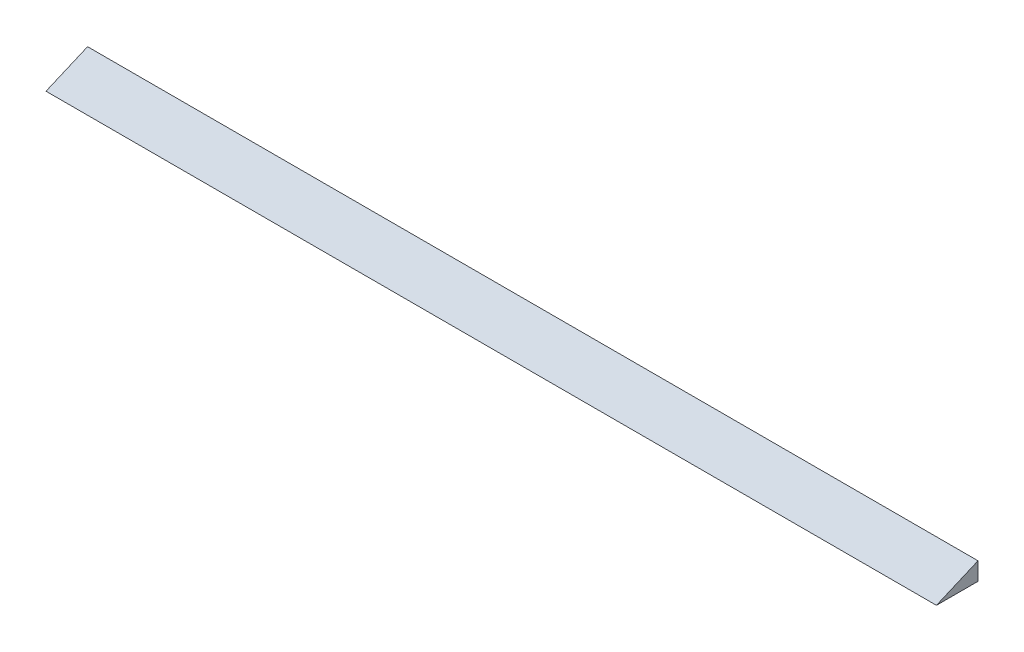
ISO-10303-21;
HEADER;
FILE_DESCRIPTION(('STEP AP214'),'2;1');
FILE_NAME('part.step','',(''),(''),'','','');
FILE_SCHEMA(('AUTOMOTIVE_DESIGN { 1 0 10303 214 1 1 1 1 }'));
ENDSEC;
DATA;
#1=APPLICATION_CONTEXT('core data for automotive mechanical design processes');
#2=APPLICATION_PROTOCOL_DEFINITION('international standard','automotive_design',2000,#1);
#3=PRODUCT_CONTEXT('',#1,'mechanical');
#4=PRODUCT('Part','Part','',(#3));
#5=PRODUCT_RELATED_PRODUCT_CATEGORY('part','',(#4));
#6=PRODUCT_DEFINITION_FORMATION('','',#4);
#7=PRODUCT_DEFINITION_CONTEXT('part definition',#1,'design');
#8=PRODUCT_DEFINITION('design','',#6,#7);
#9=PRODUCT_DEFINITION_SHAPE('','',#8);
#10=(LENGTH_UNIT() NAMED_UNIT(*) SI_UNIT(.MILLI.,.METRE.));
#11=(NAMED_UNIT(*) PLANE_ANGLE_UNIT() SI_UNIT($,.RADIAN.));
#12=(NAMED_UNIT(*) SI_UNIT($,.STERADIAN.) SOLID_ANGLE_UNIT());
#13=UNCERTAINTY_MEASURE_WITH_UNIT(LENGTH_MEASURE(1.E-05),#10,'distance_accuracy_value','');
#14=(GEOMETRIC_REPRESENTATION_CONTEXT(3) GLOBAL_UNCERTAINTY_ASSIGNED_CONTEXT((#13)) GLOBAL_UNIT_ASSIGNED_CONTEXT((#10,
#11,#12)) REPRESENTATION_CONTEXT('',''));
#15=CARTESIAN_POINT('',(0.,0.,0.));
#16=DIRECTION('',(0.,0.,1.));
#17=DIRECTION('',(1.,0.,0.));
#18=AXIS2_PLACEMENT_3D('',#15,#16,#17);
#19=CARTESIAN_POINT('',(75.,0.,7.));
#20=DIRECTION('',(0.,1.,0.));
#21=DIRECTION('',(0.,0.,1.));
#22=AXIS2_PLACEMENT_3D('',#19,#20,#21);
#23=PLANE('',#22);
#24=DIRECTION('',(0.,0.,-1.));
#25=VECTOR('',#24,1.);
#26=CARTESIAN_POINT('',(-75.,0.,7.));
#27=LINE('',#26,#25);
#28=CARTESIAN_POINT('',(-75.,0.,7.));
#29=VERTEX_POINT('',#28);
#30=CARTESIAN_POINT('',(-75.,0.,0.));
#31=VERTEX_POINT('',#30);
#32=EDGE_CURVE('E82',#29,#31,#27,.T.);
#33=ORIENTED_EDGE('',*,*,#32,.T.);
#34=DIRECTION('',(-1.,0.,0.));
#35=VECTOR('',#34,1.);
#36=CARTESIAN_POINT('',(75.,0.,0.));
#37=LINE('',#36,#35);
#38=CARTESIAN_POINT('',(75.,0.,0.));
#39=VERTEX_POINT('',#38);
#40=EDGE_CURVE('E11',#39,#31,#37,.T.);
#41=ORIENTED_EDGE('',*,*,#40,.F.);
#42=DIRECTION('',(0.,0.,-1.));
#43=VECTOR('',#42,1.);
#44=CARTESIAN_POINT('',(75.,0.,7.));
#45=LINE('',#44,#43);
#46=CARTESIAN_POINT('',(75.,0.,7.));
#47=VERTEX_POINT('',#46);
#48=EDGE_CURVE('E75',#47,#39,#45,.T.);
#49=ORIENTED_EDGE('',*,*,#48,.F.);
#50=DIRECTION('',(-1.,0.,0.));
#51=VECTOR('',#50,1.);
#52=CARTESIAN_POINT('',(75.,0.,7.));
#53=LINE('',#52,#51);
#54=EDGE_CURVE('E83',#47,#29,#53,.T.);
#55=ORIENTED_EDGE('',*,*,#54,.T.);
#56=EDGE_LOOP('',(#33,#41,#49,#55));
#57=FACE_BOUND('',#56,.T.);
#58=ADVANCED_FACE('F35',(#57),#23,.F.);
#59=CARTESIAN_POINT('',(75.,0.,0.));
#60=DIRECTION('',(0.,0.,1.));
#61=DIRECTION('',(1.,0.,0.));
#62=AXIS2_PLACEMENT_3D('',#59,#60,#61);
#63=PLANE('',#62);
#64=DIRECTION('',(0.,1.,0.));
#65=VECTOR('',#64,1.);
#66=CARTESIAN_POINT('',(-75.,0.,0.));
#67=LINE('',#66,#65);
#68=CARTESIAN_POINT('',(-75.,3.,0.));
#69=VERTEX_POINT('',#68);
#70=EDGE_CURVE('E63',#31,#69,#67,.T.);
#71=ORIENTED_EDGE('',*,*,#70,.T.);
#72=DIRECTION('',(-1.,0.,0.));
#73=VECTOR('',#72,1.);
#74=CARTESIAN_POINT('',(75.,3.,0.));
#75=LINE('',#74,#73);
#76=CARTESIAN_POINT('',(75.,3.,0.));
#77=VERTEX_POINT('',#76);
#78=EDGE_CURVE('E43',#77,#69,#75,.T.);
#79=ORIENTED_EDGE('',*,*,#78,.F.);
#80=DIRECTION('',(0.,1.,0.));
#81=VECTOR('',#80,1.);
#82=CARTESIAN_POINT('',(75.,0.,0.));
#83=LINE('',#82,#81);
#84=EDGE_CURVE('E71',#39,#77,#83,.T.);
#85=ORIENTED_EDGE('',*,*,#84,.F.);
#86=ORIENTED_EDGE('',*,*,#40,.T.);
#87=EDGE_LOOP('',(#71,#79,#85,#86));
#88=FACE_BOUND('',#87,.T.);
#89=ADVANCED_FACE('F72',(#88),#63,.F.);
#90=CARTESIAN_POINT('',(75.,3.,0.));
#91=DIRECTION('',(0.,-0.919145030018058,-0.393919298579168));
#92=DIRECTION('',(0.,0.393919298579168,-0.919145030018058));
#93=AXIS2_PLACEMENT_3D('',#90,#91,#92);
#94=PLANE('',#93);
#95=DIRECTION('',(0.,-0.393919298579168,0.919145030018058));
#96=VECTOR('',#95,1.);
#97=CARTESIAN_POINT('',(-75.,3.,0.));
#98=LINE('',#97,#96);
#99=EDGE_CURVE('E68',#69,#29,#98,.T.);
#100=ORIENTED_EDGE('',*,*,#99,.T.);
#101=ORIENTED_EDGE('',*,*,#54,.F.);
#102=DIRECTION('',(0.,-0.393919298579168,0.919145030018058));
#103=VECTOR('',#102,1.);
#104=CARTESIAN_POINT('',(75.,3.,0.));
#105=LINE('',#104,#103);
#106=EDGE_CURVE('E51',#77,#47,#105,.T.);
#107=ORIENTED_EDGE('',*,*,#106,.F.);
#108=ORIENTED_EDGE('',*,*,#78,.T.);
#109=EDGE_LOOP('',(#100,#101,#107,#108));
#110=FACE_BOUND('',#109,.T.);
#111=ADVANCED_FACE('F90',(#110),#94,.F.);
#112=CARTESIAN_POINT('',(75.,0.,0.));
#113=DIRECTION('',(1.,0.,0.));
#114=DIRECTION('',(0.,0.,-1.));
#115=AXIS2_PLACEMENT_3D('',#112,#113,#114);
#116=PLANE('',#115);
#117=ORIENTED_EDGE('',*,*,#48,.T.);
#118=ORIENTED_EDGE('',*,*,#84,.T.);
#119=ORIENTED_EDGE('',*,*,#106,.T.);
#120=EDGE_LOOP('',(#117,#118,#119));
#121=FACE_BOUND('',#120,.T.);
#122=ADVANCED_FACE('F78',(#121),#116,.T.);
#123=CARTESIAN_POINT('',(-75.,0.,0.));
#124=DIRECTION('',(1.,0.,0.));
#125=DIRECTION('',(0.,0.,-1.));
#126=AXIS2_PLACEMENT_3D('',#123,#124,#125);
#127=PLANE('',#126);
#128=ORIENTED_EDGE('',*,*,#32,.F.);
#129=ORIENTED_EDGE('',*,*,#99,.F.);
#130=ORIENTED_EDGE('',*,*,#70,.F.);
#131=EDGE_LOOP('',(#128,#129,#130));
#132=FACE_BOUND('',#131,.T.);
#133=ADVANCED_FACE('F91',(#132),#127,.F.);
#134=CLOSED_SHELL('',(#58,#89,#111,#122,#133));
#135=MANIFOLD_SOLID_BREP('B2',#134);
#136=ADVANCED_BREP_SHAPE_REPRESENTATION('',(#18,#135),#14);
#137=SHAPE_DEFINITION_REPRESENTATION(#9,#136);
ENDSEC;
END-ISO-10303-21;
